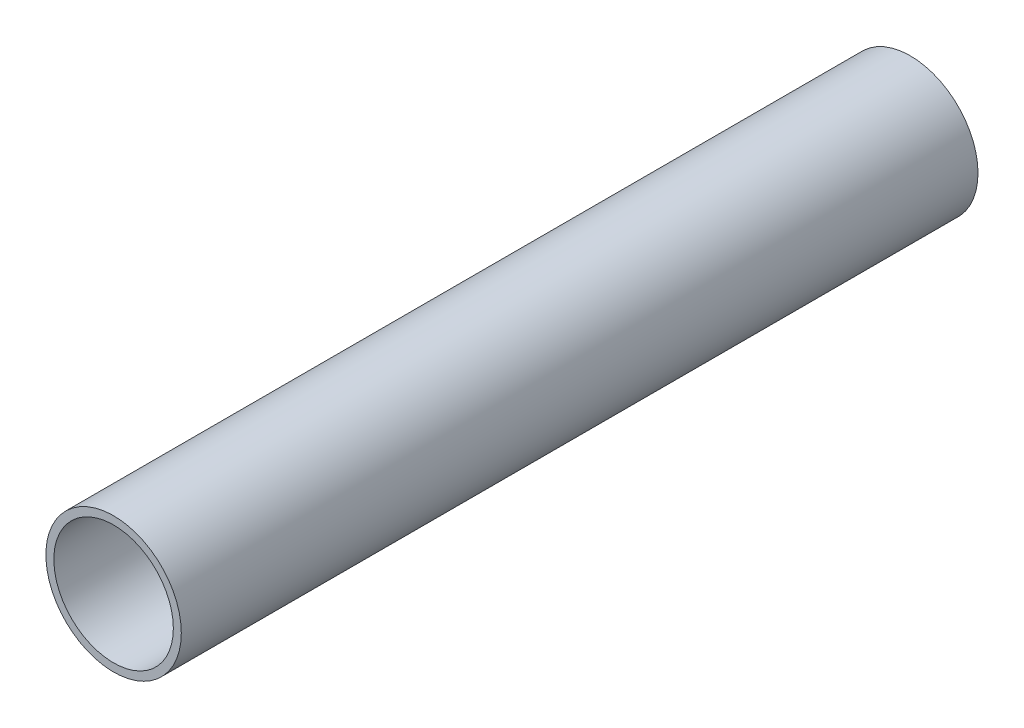
ISO-10303-21;
HEADER;
FILE_DESCRIPTION(('STEP AP214'),'2;1');
FILE_NAME('part.step','',(''),(''),'','','');
FILE_SCHEMA(('AUTOMOTIVE_DESIGN { 1 0 10303 214 1 1 1 1 }'));
ENDSEC;
DATA;
#1=APPLICATION_CONTEXT('core data for automotive mechanical design processes');
#2=APPLICATION_PROTOCOL_DEFINITION('international standard','automotive_design',2000,#1);
#3=PRODUCT_CONTEXT('',#1,'mechanical');
#4=PRODUCT('Part','Part','',(#3));
#5=PRODUCT_RELATED_PRODUCT_CATEGORY('part','',(#4));
#6=PRODUCT_DEFINITION_FORMATION('','',#4);
#7=PRODUCT_DEFINITION_CONTEXT('part definition',#1,'design');
#8=PRODUCT_DEFINITION('design','',#6,#7);
#9=PRODUCT_DEFINITION_SHAPE('','',#8);
#10=(LENGTH_UNIT() NAMED_UNIT(*) SI_UNIT(.MILLI.,.METRE.));
#11=(NAMED_UNIT(*) PLANE_ANGLE_UNIT() SI_UNIT($,.RADIAN.));
#12=(NAMED_UNIT(*) SI_UNIT($,.STERADIAN.) SOLID_ANGLE_UNIT());
#13=UNCERTAINTY_MEASURE_WITH_UNIT(LENGTH_MEASURE(1.E-05),#10,'distance_accuracy_value','');
#14=(GEOMETRIC_REPRESENTATION_CONTEXT(3) GLOBAL_UNCERTAINTY_ASSIGNED_CONTEXT((#13)) GLOBAL_UNIT_ASSIGNED_CONTEXT((#10,
#11,#12)) REPRESENTATION_CONTEXT('',''));
#15=CARTESIAN_POINT('',(0.,0.,0.));
#16=DIRECTION('',(0.,0.,1.));
#17=DIRECTION('',(1.,0.,0.));
#18=AXIS2_PLACEMENT_3D('',#15,#16,#17);
#19=CARTESIAN_POINT('',(0.,0.,100.));
#20=DIRECTION('',(0.,0.,-1.));
#21=DIRECTION('',(-1.,0.,0.));
#22=AXIS2_PLACEMENT_3D('',#19,#20,#21);
#23=CYLINDRICAL_SURFACE('',#22,15.);
#24=CARTESIAN_POINT('',(0.,0.,100.));
#25=DIRECTION('',(0.,0.,1.));
#26=DIRECTION('',(1.,0.,0.));
#27=AXIS2_PLACEMENT_3D('',#24,#25,#26);
#28=CIRCLE('',#27,15.);
#29=CARTESIAN_POINT('',(15.,0.,100.));
#30=VERTEX_POINT('',#29);
#31=EDGE_CURVE('E40',#30,#30,#28,.T.);
#32=ORIENTED_EDGE('',*,*,#31,.T.);
#33=EDGE_LOOP('',(#32));
#34=FACE_BOUND('',#33,.T.);
#35=CARTESIAN_POINT('',(0.,0.,-100.));
#36=DIRECTION('',(0.,0.,1.));
#37=DIRECTION('',(1.,0.,0.));
#38=AXIS2_PLACEMENT_3D('',#35,#36,#37);
#39=CIRCLE('',#38,15.);
#40=CARTESIAN_POINT('',(15.,0.,-100.));
#41=VERTEX_POINT('',#40);
#42=EDGE_CURVE('E46',#41,#41,#39,.T.);
#43=ORIENTED_EDGE('',*,*,#42,.F.);
#44=EDGE_LOOP('',(#43));
#45=FACE_BOUND('',#44,.T.);
#46=ADVANCED_FACE('F33',(#34,#45),#23,.F.);
#47=CARTESIAN_POINT('',(0.,0.,100.));
#48=DIRECTION('',(0.,0.,-1.));
#49=DIRECTION('',(-1.,0.,0.));
#50=AXIS2_PLACEMENT_3D('',#47,#48,#49);
#51=CYLINDRICAL_SURFACE('',#50,17.);
#52=CARTESIAN_POINT('',(0.,0.,100.));
#53=DIRECTION('',(0.,0.,1.));
#54=DIRECTION('',(1.,0.,0.));
#55=AXIS2_PLACEMENT_3D('',#52,#53,#54);
#56=CIRCLE('',#55,17.);
#57=CARTESIAN_POINT('',(17.,0.,100.));
#58=VERTEX_POINT('',#57);
#59=EDGE_CURVE('E10',#58,#58,#56,.T.);
#60=ORIENTED_EDGE('',*,*,#59,.F.);
#61=EDGE_LOOP('',(#60));
#62=FACE_BOUND('',#61,.T.);
#63=CARTESIAN_POINT('',(0.,0.,-100.));
#64=DIRECTION('',(0.,0.,1.));
#65=DIRECTION('',(1.,0.,0.));
#66=AXIS2_PLACEMENT_3D('',#63,#64,#65);
#67=CIRCLE('',#66,17.);
#68=CARTESIAN_POINT('',(17.,0.,-100.));
#69=VERTEX_POINT('',#68);
#70=EDGE_CURVE('E36',#69,#69,#67,.T.);
#71=ORIENTED_EDGE('',*,*,#70,.T.);
#72=EDGE_LOOP('',(#71));
#73=FACE_BOUND('',#72,.T.);
#74=ADVANCED_FACE('F53',(#62,#73),#51,.T.);
#75=CARTESIAN_POINT('',(0.,0.,100.));
#76=DIRECTION('',(0.,0.,1.));
#77=DIRECTION('',(1.,0.,0.));
#78=AXIS2_PLACEMENT_3D('',#75,#76,#77);
#79=PLANE('',#78);
#80=ORIENTED_EDGE('',*,*,#31,.F.);
#81=EDGE_LOOP('',(#80));
#82=FACE_BOUND('',#81,.T.);
#83=ORIENTED_EDGE('',*,*,#59,.T.);
#84=EDGE_LOOP('',(#83));
#85=FACE_BOUND('',#84,.T.);
#86=ADVANCED_FACE('F57',(#82,#85),#79,.T.);
#87=CARTESIAN_POINT('',(0.,0.,-100.));
#88=DIRECTION('',(0.,0.,1.));
#89=DIRECTION('',(1.,0.,0.));
#90=AXIS2_PLACEMENT_3D('',#87,#88,#89);
#91=PLANE('',#90);
#92=ORIENTED_EDGE('',*,*,#42,.T.);
#93=EDGE_LOOP('',(#92));
#94=FACE_BOUND('',#93,.T.);
#95=ORIENTED_EDGE('',*,*,#70,.F.);
#96=EDGE_LOOP('',(#95));
#97=FACE_BOUND('',#96,.T.);
#98=ADVANCED_FACE('F55',(#94,#97),#91,.F.);
#99=CLOSED_SHELL('',(#46,#74,#86,#98));
#100=MANIFOLD_SOLID_BREP('B2',#99);
#101=ADVANCED_BREP_SHAPE_REPRESENTATION('',(#18,#100),#14);
#102=SHAPE_DEFINITION_REPRESENTATION(#9,#101);
ENDSEC;
END-ISO-10303-21;
